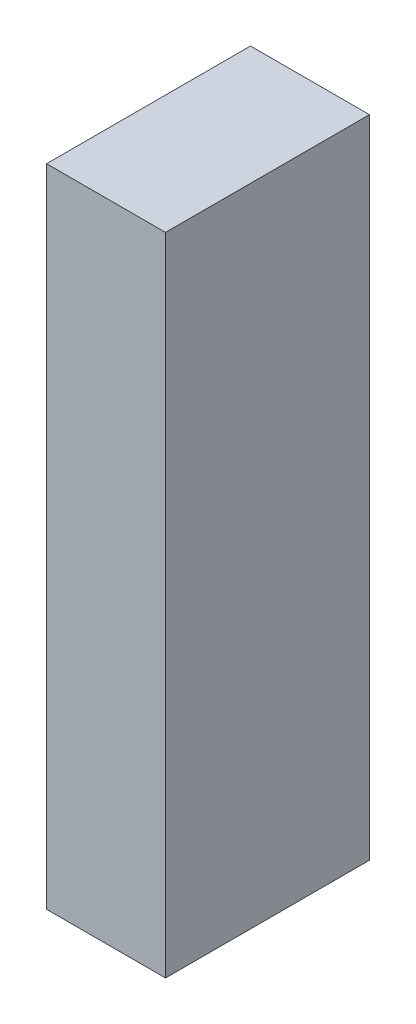
ISO-10303-21;
HEADER;
FILE_DESCRIPTION(('STEP AP214'),'2;1');
FILE_NAME('part.step','',(''),(''),'','','');
FILE_SCHEMA(('AUTOMOTIVE_DESIGN { 1 0 10303 214 1 1 1 1 }'));
ENDSEC;
DATA;
#1=APPLICATION_CONTEXT('core data for automotive mechanical design processes');
#2=APPLICATION_PROTOCOL_DEFINITION('international standard','automotive_design',2000,#1);
#3=PRODUCT_CONTEXT('',#1,'mechanical');
#4=PRODUCT('Part','Part','',(#3));
#5=PRODUCT_RELATED_PRODUCT_CATEGORY('part','',(#4));
#6=PRODUCT_DEFINITION_FORMATION('','',#4);
#7=PRODUCT_DEFINITION_CONTEXT('part definition',#1,'design');
#8=PRODUCT_DEFINITION('design','',#6,#7);
#9=PRODUCT_DEFINITION_SHAPE('','',#8);
#10=(LENGTH_UNIT() NAMED_UNIT(*) SI_UNIT(.MILLI.,.METRE.));
#11=(NAMED_UNIT(*) PLANE_ANGLE_UNIT() SI_UNIT($,.RADIAN.));
#12=(NAMED_UNIT(*) SI_UNIT($,.STERADIAN.) SOLID_ANGLE_UNIT());
#13=UNCERTAINTY_MEASURE_WITH_UNIT(LENGTH_MEASURE(1.E-05),#10,'distance_accuracy_value','');
#14=(GEOMETRIC_REPRESENTATION_CONTEXT(3) GLOBAL_UNCERTAINTY_ASSIGNED_CONTEXT((#13)) GLOBAL_UNIT_ASSIGNED_CONTEXT((#10,
#11,#12)) REPRESENTATION_CONTEXT('',''));
#15=CARTESIAN_POINT('',(0.,0.,0.));
#16=DIRECTION('',(0.,0.,1.));
#17=DIRECTION('',(1.,0.,0.));
#18=AXIS2_PLACEMENT_3D('',#15,#16,#17);
#19=CARTESIAN_POINT('',(28.,76.,-24.));
#20=DIRECTION('',(0.,0.,1.));
#21=DIRECTION('',(0.,-1.,0.));
#22=AXIS2_PLACEMENT_3D('',#19,#20,#21);
#23=PLANE('',#22);
#24=DIRECTION('',(0.,1.,0.));
#25=VECTOR('',#24,1.);
#26=CARTESIAN_POINT('',(0.,76.,-24.));
#27=LINE('',#26,#25);
#28=CARTESIAN_POINT('',(0.,-76.,-24.));
#29=VERTEX_POINT('',#28);
#30=CARTESIAN_POINT('',(0.,76.,-24.));
#31=VERTEX_POINT('',#30);
#32=EDGE_CURVE('E111',#29,#31,#27,.T.);
#33=ORIENTED_EDGE('',*,*,#32,.T.);
#34=DIRECTION('',(-1.,0.,0.));
#35=VECTOR('',#34,1.);
#36=CARTESIAN_POINT('',(28.,76.,-24.));
#37=LINE('',#36,#35);
#38=CARTESIAN_POINT('',(28.,76.,-24.));
#39=VERTEX_POINT('',#38);
#40=EDGE_CURVE('E11',#39,#31,#37,.T.);
#41=ORIENTED_EDGE('',*,*,#40,.F.);
#42=DIRECTION('',(0.,1.,0.));
#43=VECTOR('',#42,1.);
#44=CARTESIAN_POINT('',(28.,76.,-24.));
#45=LINE('',#44,#43);
#46=CARTESIAN_POINT('',(28.,-76.,-24.));
#47=VERTEX_POINT('',#46);
#48=EDGE_CURVE('E95',#47,#39,#45,.T.);
#49=ORIENTED_EDGE('',*,*,#48,.F.);
#50=DIRECTION('',(-1.,0.,0.));
#51=VECTOR('',#50,1.);
#52=CARTESIAN_POINT('',(28.,-76.,-24.));
#53=LINE('',#52,#51);
#54=EDGE_CURVE('E107',#47,#29,#53,.T.);
#55=ORIENTED_EDGE('',*,*,#54,.T.);
#56=EDGE_LOOP('',(#33,#41,#49,#55));
#57=FACE_BOUND('',#56,.T.);
#58=ADVANCED_FACE('F43',(#57),#23,.F.);
#59=CARTESIAN_POINT('',(28.,76.,-24.));
#60=DIRECTION('',(0.,-1.,0.));
#61=DIRECTION('',(0.,0.,-1.));
#62=AXIS2_PLACEMENT_3D('',#59,#60,#61);
#63=PLANE('',#62);
#64=DIRECTION('',(0.,0.,1.));
#65=VECTOR('',#64,1.);
#66=CARTESIAN_POINT('',(0.,76.,-24.));
#67=LINE('',#66,#65);
#68=CARTESIAN_POINT('',(0.,76.,24.));
#69=VERTEX_POINT('',#68);
#70=EDGE_CURVE('E100',#31,#69,#67,.T.);
#71=ORIENTED_EDGE('',*,*,#70,.T.);
#72=DIRECTION('',(-1.,0.,0.));
#73=VECTOR('',#72,1.);
#74=CARTESIAN_POINT('',(28.,76.,24.));
#75=LINE('',#74,#73);
#76=CARTESIAN_POINT('',(28.,76.,24.));
#77=VERTEX_POINT('',#76);
#78=EDGE_CURVE('E52',#77,#69,#75,.T.);
#79=ORIENTED_EDGE('',*,*,#78,.F.);
#80=DIRECTION('',(0.,0.,1.));
#81=VECTOR('',#80,1.);
#82=CARTESIAN_POINT('',(28.,76.,-24.));
#83=LINE('',#82,#81);
#84=EDGE_CURVE('E90',#39,#77,#83,.T.);
#85=ORIENTED_EDGE('',*,*,#84,.F.);
#86=ORIENTED_EDGE('',*,*,#40,.T.);
#87=EDGE_LOOP('',(#71,#79,#85,#86));
#88=FACE_BOUND('',#87,.T.);
#89=ADVANCED_FACE('F99',(#88),#63,.F.);
#90=CARTESIAN_POINT('',(28.,76.,24.));
#91=DIRECTION('',(0.,0.,-1.));
#92=DIRECTION('',(0.,1.,0.));
#93=AXIS2_PLACEMENT_3D('',#90,#91,#92);
#94=PLANE('',#93);
#95=DIRECTION('',(0.,-1.,0.));
#96=VECTOR('',#95,1.);
#97=CARTESIAN_POINT('',(0.,76.,24.));
#98=LINE('',#97,#96);
#99=CARTESIAN_POINT('',(0.,-76.,24.));
#100=VERTEX_POINT('',#99);
#101=EDGE_CURVE('E77',#69,#100,#98,.T.);
#102=ORIENTED_EDGE('',*,*,#101,.T.);
#103=DIRECTION('',(-1.,0.,0.));
#104=VECTOR('',#103,1.);
#105=CARTESIAN_POINT('',(28.,-76.,24.));
#106=LINE('',#105,#104);
#107=CARTESIAN_POINT('',(28.,-76.,24.));
#108=VERTEX_POINT('',#107);
#109=EDGE_CURVE('E102',#108,#100,#106,.T.);
#110=ORIENTED_EDGE('',*,*,#109,.F.);
#111=DIRECTION('',(0.,-1.,0.));
#112=VECTOR('',#111,1.);
#113=CARTESIAN_POINT('',(28.,76.,24.));
#114=LINE('',#113,#112);
#115=EDGE_CURVE('E93',#77,#108,#114,.T.);
#116=ORIENTED_EDGE('',*,*,#115,.F.);
#117=ORIENTED_EDGE('',*,*,#78,.T.);
#118=EDGE_LOOP('',(#102,#110,#116,#117));
#119=FACE_BOUND('',#118,.T.);
#120=ADVANCED_FACE('F103',(#119),#94,.F.);
#121=CARTESIAN_POINT('',(28.,-76.,-24.));
#122=DIRECTION('',(0.,1.,0.));
#123=DIRECTION('',(0.,0.,1.));
#124=AXIS2_PLACEMENT_3D('',#121,#122,#123);
#125=PLANE('',#124);
#126=DIRECTION('',(0.,0.,-1.));
#127=VECTOR('',#126,1.);
#128=CARTESIAN_POINT('',(0.,-76.,-24.));
#129=LINE('',#128,#127);
#130=EDGE_CURVE('E83',#100,#29,#129,.T.);
#131=ORIENTED_EDGE('',*,*,#130,.T.);
#132=ORIENTED_EDGE('',*,*,#54,.F.);
#133=DIRECTION('',(0.,0.,-1.));
#134=VECTOR('',#133,1.);
#135=CARTESIAN_POINT('',(28.,-76.,-24.));
#136=LINE('',#135,#134);
#137=EDGE_CURVE('E60',#108,#47,#136,.T.);
#138=ORIENTED_EDGE('',*,*,#137,.F.);
#139=ORIENTED_EDGE('',*,*,#109,.T.);
#140=EDGE_LOOP('',(#131,#132,#138,#139));
#141=FACE_BOUND('',#140,.T.);
#142=ADVANCED_FACE('F124',(#141),#125,.F.);
#143=CARTESIAN_POINT('',(28.,0.,0.));
#144=DIRECTION('',(-1.,0.,0.));
#145=DIRECTION('',(0.,0.,1.));
#146=AXIS2_PLACEMENT_3D('',#143,#144,#145);
#147=PLANE('',#146);
#148=ORIENTED_EDGE('',*,*,#48,.T.);
#149=ORIENTED_EDGE('',*,*,#84,.T.);
#150=ORIENTED_EDGE('',*,*,#115,.T.);
#151=ORIENTED_EDGE('',*,*,#137,.T.);
#152=EDGE_LOOP('',(#148,#149,#150,#151));
#153=FACE_BOUND('',#152,.T.);
#154=ADVANCED_FACE('F91',(#153),#147,.F.);
#155=CARTESIAN_POINT('',(0.,0.,0.));
#156=DIRECTION('',(-1.,0.,0.));
#157=DIRECTION('',(0.,0.,1.));
#158=AXIS2_PLACEMENT_3D('',#155,#156,#157);
#159=PLANE('',#158);
#160=ORIENTED_EDGE('',*,*,#32,.F.);
#161=ORIENTED_EDGE('',*,*,#130,.F.);
#162=ORIENTED_EDGE('',*,*,#101,.F.);
#163=ORIENTED_EDGE('',*,*,#70,.F.);
#164=EDGE_LOOP('',(#160,#161,#162,#163));
#165=FACE_BOUND('',#164,.T.);
#166=ADVANCED_FACE('F127',(#165),#159,.T.);
#167=CLOSED_SHELL('',(#58,#89,#120,#142,#154,#166));
#168=MANIFOLD_SOLID_BREP('B2',#167);
#169=ADVANCED_BREP_SHAPE_REPRESENTATION('',(#18,#168),#14);
#170=SHAPE_DEFINITION_REPRESENTATION(#9,#169);
ENDSEC;
END-ISO-10303-21;
